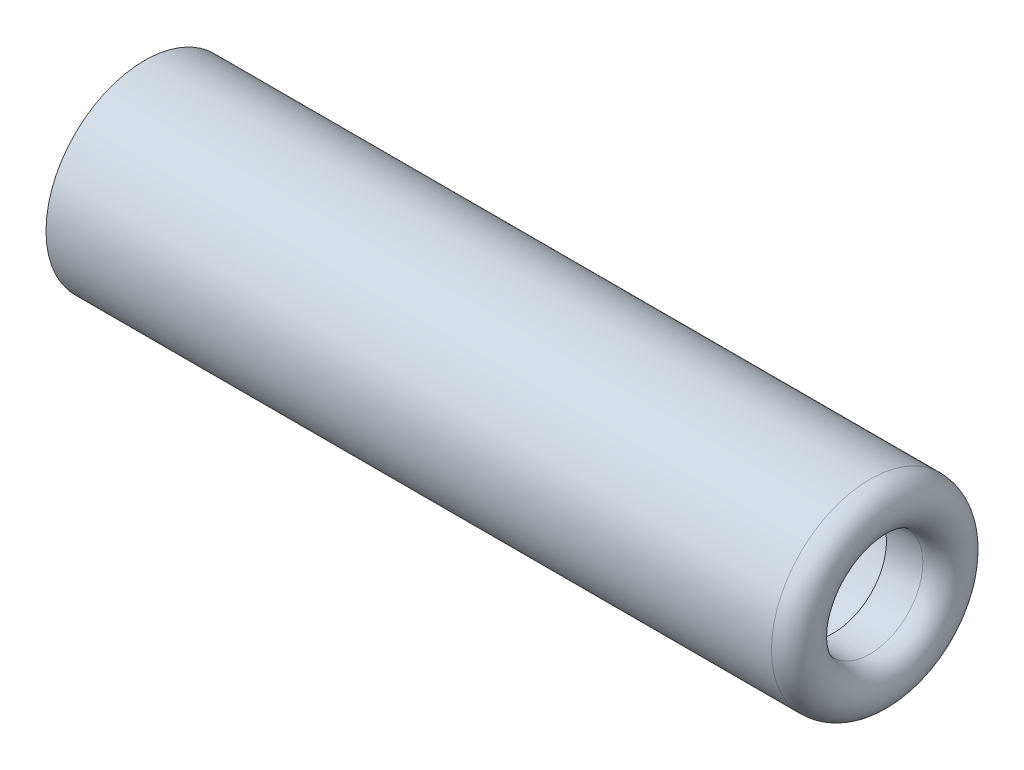
ISO-10303-21;
HEADER;
FILE_DESCRIPTION(('STEP AP214'),'2;1');
FILE_NAME('part.step','',(''),(''),'','','');
FILE_SCHEMA(('AUTOMOTIVE_DESIGN { 1 0 10303 214 1 1 1 1 }'));
ENDSEC;
DATA;
#1=APPLICATION_CONTEXT('core data for automotive mechanical design processes');
#2=APPLICATION_PROTOCOL_DEFINITION('international standard','automotive_design',2000,#1);
#3=PRODUCT_CONTEXT('',#1,'mechanical');
#4=PRODUCT('Part','Part','',(#3));
#5=PRODUCT_RELATED_PRODUCT_CATEGORY('part','',(#4));
#6=PRODUCT_DEFINITION_FORMATION('','',#4);
#7=PRODUCT_DEFINITION_CONTEXT('part definition',#1,'design');
#8=PRODUCT_DEFINITION('design','',#6,#7);
#9=PRODUCT_DEFINITION_SHAPE('','',#8);
#10=(LENGTH_UNIT() NAMED_UNIT(*) SI_UNIT(.MILLI.,.METRE.));
#11=(NAMED_UNIT(*) PLANE_ANGLE_UNIT() SI_UNIT($,.RADIAN.));
#12=(NAMED_UNIT(*) SI_UNIT($,.STERADIAN.) SOLID_ANGLE_UNIT());
#13=UNCERTAINTY_MEASURE_WITH_UNIT(LENGTH_MEASURE(1.E-05),#10,'distance_accuracy_value','');
#14=(GEOMETRIC_REPRESENTATION_CONTEXT(3) GLOBAL_UNCERTAINTY_ASSIGNED_CONTEXT((#13)) GLOBAL_UNIT_ASSIGNED_CONTEXT((#10,
#11,#12)) REPRESENTATION_CONTEXT('',''));
#15=CARTESIAN_POINT('',(0.,0.,0.));
#16=DIRECTION('',(0.,0.,1.));
#17=DIRECTION('',(1.,0.,0.));
#18=AXIS2_PLACEMENT_3D('',#15,#16,#17);
#19=CARTESIAN_POINT('',(39.7603578881721,5.40085337563667E-11,7.76121571524624E-12));
#20=DIRECTION('',(-1.,-2.6867710855425E-12,4.25323759313716E-13));
#21=DIRECTION('',(4.25323759313716E-13,0.,1.));
#22=AXIS2_PLACEMENT_3D('',#19,#20,#21);
#23=TOROIDAL_SURFACE('',#22,1.20015000002581,0.361949999992436);
#24=CARTESIAN_POINT('',(39.76035788817,0.,0.));
#25=DIRECTION('',(-1.,0.,0.));
#26=DIRECTION('',(0.,0.,-1.));
#27=AXIS2_PLACEMENT_3D('',#24,#25,#26);
#28=CIRCLE('',#27,0.8382);
#29=CARTESIAN_POINT('',(39.76035788817,0.,-0.8382));
#30=VERTEX_POINT('',#29);
#31=EDGE_CURVE('E23',#30,#30,#28,.T.);
#32=ORIENTED_EDGE('',*,*,#31,.T.);
#33=EDGE_LOOP('',(#32));
#34=FACE_BOUND('',#33,.T.);
#35=CARTESIAN_POINT('',(39.76035788817,0.,0.));
#36=DIRECTION('',(1.,0.,0.));
#37=DIRECTION('',(0.,0.,1.));
#38=AXIS2_PLACEMENT_3D('',#35,#36,#37);
#39=CIRCLE('',#38,1.5621);
#40=CARTESIAN_POINT('',(39.76035788817,0.,1.5621));
#41=VERTEX_POINT('',#40);
#42=EDGE_CURVE('E10',#41,#41,#39,.T.);
#43=ORIENTED_EDGE('',*,*,#42,.T.);
#44=EDGE_LOOP('',(#43));
#45=FACE_BOUND('',#44,.T.);
#46=ADVANCED_FACE('F15',(#34,#45),#23,.T.);
#47=CARTESIAN_POINT('',(0.,0.,0.));
#48=DIRECTION('',(-1.,0.,0.));
#49=DIRECTION('',(0.,0.,1.));
#50=AXIS2_PLACEMENT_3D('',#47,#48,#49);
#51=CYLINDRICAL_SURFACE('',#50,1.5621);
#52=ORIENTED_EDGE('',*,*,#42,.F.);
#53=EDGE_LOOP('',(#52));
#54=FACE_BOUND('',#53,.T.);
#55=CARTESIAN_POINT('',(28.26050788817,0.,0.));
#56=DIRECTION('',(-1.,0.,0.));
#57=DIRECTION('',(0.,0.,1.));
#58=AXIS2_PLACEMENT_3D('',#55,#56,#57);
#59=CIRCLE('',#58,1.5621);
#60=CARTESIAN_POINT('',(28.26050788817,0.,1.5621));
#61=VERTEX_POINT('',#60);
#62=EDGE_CURVE('E31',#61,#61,#59,.T.);
#63=ORIENTED_EDGE('',*,*,#62,.F.);
#64=EDGE_LOOP('',(#63));
#65=FACE_BOUND('',#64,.T.);
#66=ADVANCED_FACE('F77',(#54,#65),#51,.T.);
#67=CARTESIAN_POINT('',(0.,0.,0.));
#68=DIRECTION('',(-1.,0.,0.));
#69=DIRECTION('',(0.,0.,1.));
#70=AXIS2_PLACEMENT_3D('',#67,#68,#69);
#71=CYLINDRICAL_SURFACE('',#70,0.8382);
#72=CARTESIAN_POINT('',(39.18250788817,0.,0.));
#73=DIRECTION('',(1.,0.,0.));
#74=DIRECTION('',(0.,0.,1.));
#75=AXIS2_PLACEMENT_3D('',#72,#73,#74);
#76=CIRCLE('',#75,0.8382);
#77=CARTESIAN_POINT('',(39.18250788817,0.,0.8382));
#78=VERTEX_POINT('',#77);
#79=EDGE_CURVE('E35',#78,#78,#76,.T.);
#80=ORIENTED_EDGE('',*,*,#79,.F.);
#81=EDGE_LOOP('',(#80));
#82=FACE_BOUND('',#81,.T.);
#83=ORIENTED_EDGE('',*,*,#31,.F.);
#84=EDGE_LOOP('',(#83));
#85=FACE_BOUND('',#84,.T.);
#86=ADVANCED_FACE('F71',(#82,#85),#71,.F.);
#87=CARTESIAN_POINT('',(39.18250788817,1.05029,0.));
#88=DIRECTION('',(1.,0.,0.));
#89=DIRECTION('',(0.,0.,-1.));
#90=AXIS2_PLACEMENT_3D('',#87,#88,#89);
#91=PLANE('',#90);
#92=CARTESIAN_POINT('',(39.18250788817,0.,0.));
#93=DIRECTION('',(-1.,0.,0.));
#94=DIRECTION('',(0.,0.,-1.));
#95=AXIS2_PLACEMENT_3D('',#92,#93,#94);
#96=CIRCLE('',#95,1.05029);
#97=CARTESIAN_POINT('',(39.18250788817,0.,-1.05029));
#98=VERTEX_POINT('',#97);
#99=EDGE_CURVE('E28',#98,#98,#96,.T.);
#100=ORIENTED_EDGE('',*,*,#99,.T.);
#101=EDGE_LOOP('',(#100));
#102=FACE_BOUND('',#101,.T.);
#103=ORIENTED_EDGE('',*,*,#79,.T.);
#104=EDGE_LOOP('',(#103));
#105=FACE_BOUND('',#104,.T.);
#106=ADVANCED_FACE('F65',(#102,#105),#91,.F.);
#107=CARTESIAN_POINT('',(0.,0.,0.));
#108=DIRECTION('',(-1.,0.,0.));
#109=DIRECTION('',(0.,0.,1.));
#110=AXIS2_PLACEMENT_3D('',#107,#108,#109);
#111=CYLINDRICAL_SURFACE('',#110,1.05029);
#112=CARTESIAN_POINT('',(39.76035788817,0.,0.));
#113=DIRECTION('',(1.,0.,0.));
#114=DIRECTION('',(0.,0.,1.));
#115=AXIS2_PLACEMENT_3D('',#112,#113,#114);
#116=CIRCLE('',#115,1.05029);
#117=CARTESIAN_POINT('',(39.76035788817,0.,1.05029));
#118=VERTEX_POINT('',#117);
#119=EDGE_CURVE('E38',#118,#118,#116,.T.);
#120=ORIENTED_EDGE('',*,*,#119,.F.);
#121=EDGE_LOOP('',(#120));
#122=FACE_BOUND('',#121,.T.);
#123=ORIENTED_EDGE('',*,*,#99,.F.);
#124=EDGE_LOOP('',(#123));
#125=FACE_BOUND('',#124,.T.);
#126=ADVANCED_FACE('F59',(#122,#125),#111,.T.);
#127=CARTESIAN_POINT('',(39.7603578881653,4.04720701396855E-11,5.5868937948178E-12));
#128=DIRECTION('',(-1.,-4.55296711860725E-12,7.14810293736683E-13));
#129=DIRECTION('',(7.14810293736683E-13,0.,1.));
#130=AXIS2_PLACEMENT_3D('',#127,#128,#129);
#131=TOROIDAL_SURFACE('',#130,1.20014999998034,0.149860000006556);
#132=CARTESIAN_POINT('',(39.76035788817,0.,0.));
#133=DIRECTION('',(-1.,0.,0.));
#134=DIRECTION('',(0.,0.,1.));
#135=AXIS2_PLACEMENT_3D('',#132,#133,#134);
#136=CIRCLE('',#135,1.35001);
#137=CARTESIAN_POINT('',(39.76035788817,0.,1.35001));
#138=VERTEX_POINT('',#137);
#139=EDGE_CURVE('E43',#138,#138,#136,.T.);
#140=ORIENTED_EDGE('',*,*,#139,.T.);
#141=EDGE_LOOP('',(#140));
#142=FACE_BOUND('',#141,.T.);
#143=ORIENTED_EDGE('',*,*,#119,.T.);
#144=EDGE_LOOP('',(#143));
#145=FACE_BOUND('',#144,.T.);
#146=ADVANCED_FACE('F53',(#142,#145),#131,.F.);
#147=CARTESIAN_POINT('',(0.,0.,0.));
#148=DIRECTION('',(-1.,0.,0.));
#149=DIRECTION('',(0.,0.,1.));
#150=AXIS2_PLACEMENT_3D('',#147,#148,#149);
#151=CYLINDRICAL_SURFACE('',#150,1.35001);
#152=CARTESIAN_POINT('',(28.38750788817,0.,0.));
#153=DIRECTION('',(1.,0.,0.));
#154=DIRECTION('',(0.,0.,1.));
#155=AXIS2_PLACEMENT_3D('',#152,#153,#154);
#156=CIRCLE('',#155,1.35001);
#157=CARTESIAN_POINT('',(28.38750788817,0.,1.35001));
#158=VERTEX_POINT('',#157);
#159=EDGE_CURVE('E34',#158,#158,#156,.T.);
#160=ORIENTED_EDGE('',*,*,#159,.F.);
#161=EDGE_LOOP('',(#160));
#162=FACE_BOUND('',#161,.T.);
#163=ORIENTED_EDGE('',*,*,#139,.F.);
#164=EDGE_LOOP('',(#163));
#165=FACE_BOUND('',#164,.T.);
#166=ADVANCED_FACE('F50',(#162,#165),#151,.F.);
#167=CARTESIAN_POINT('',(28.38750788817,0.,0.));
#168=DIRECTION('',(-1.,0.,0.));
#169=DIRECTION('',(0.,0.,-1.));
#170=AXIS2_PLACEMENT_3D('',#167,#168,#169);
#171=TOROIDAL_SURFACE('',#170,1.47701,0.127);
#172=CARTESIAN_POINT('',(28.26050788817,0.,0.));
#173=DIRECTION('',(1.,0.,0.));
#174=DIRECTION('',(0.,0.,1.));
#175=AXIS2_PLACEMENT_3D('',#172,#173,#174);
#176=CIRCLE('',#175,1.47701);
#177=CARTESIAN_POINT('',(28.26050788817,0.,1.47701));
#178=VERTEX_POINT('',#177);
#179=EDGE_CURVE('E19',#178,#178,#176,.T.);
#180=ORIENTED_EDGE('',*,*,#179,.F.);
#181=EDGE_LOOP('',(#180));
#182=FACE_BOUND('',#181,.T.);
#183=ORIENTED_EDGE('',*,*,#159,.T.);
#184=EDGE_LOOP('',(#183));
#185=FACE_BOUND('',#184,.T.);
#186=ADVANCED_FACE('F48',(#182,#185),#171,.T.);
#187=CARTESIAN_POINT('',(28.26050788817,1.47701,0.));
#188=DIRECTION('',(1.,0.,0.));
#189=DIRECTION('',(0.,0.,-1.));
#190=AXIS2_PLACEMENT_3D('',#187,#188,#189);
#191=PLANE('',#190);
#192=ORIENTED_EDGE('',*,*,#62,.T.);
#193=EDGE_LOOP('',(#192));
#194=FACE_BOUND('',#193,.T.);
#195=ORIENTED_EDGE('',*,*,#179,.T.);
#196=EDGE_LOOP('',(#195));
#197=FACE_BOUND('',#196,.T.);
#198=ADVANCED_FACE('F17',(#194,#197),#191,.F.);
#199=CLOSED_SHELL('',(#46,#66,#86,#106,#126,#146,#166,#186,#198));
#200=MANIFOLD_SOLID_BREP('B1',#199);
#201=ADVANCED_BREP_SHAPE_REPRESENTATION('',(#18,#200),#14);
#202=SHAPE_DEFINITION_REPRESENTATION(#9,#201);
ENDSEC;
END-ISO-10303-21;
